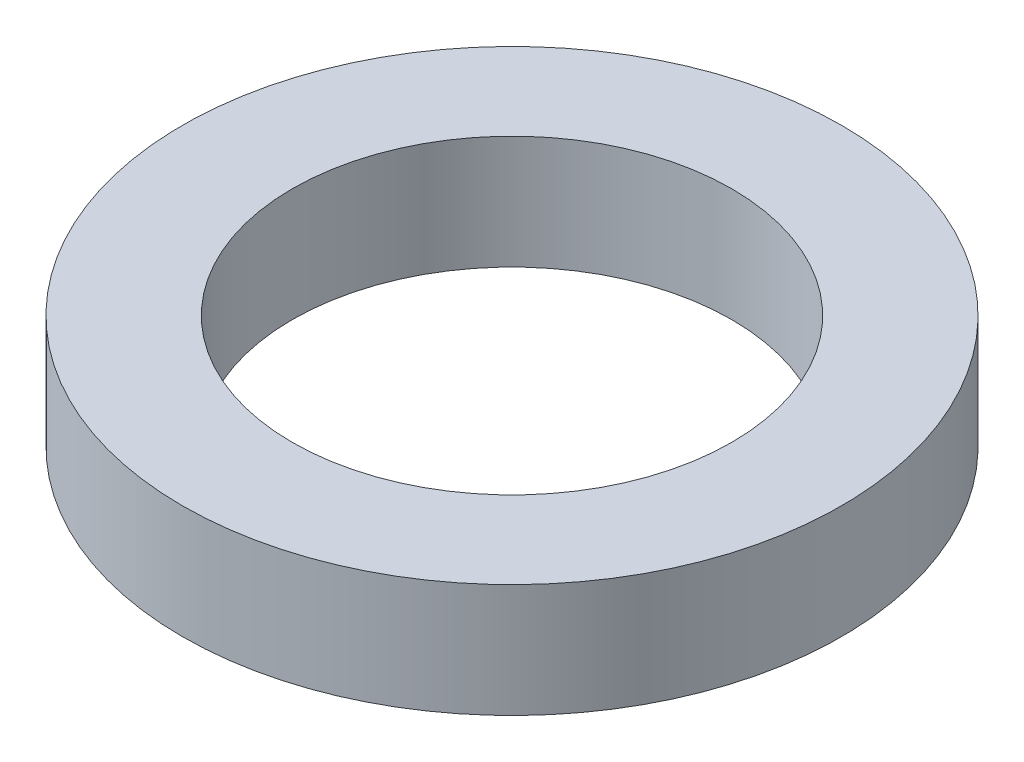
ISO-10303-21;
HEADER;
FILE_DESCRIPTION(('STEP AP214'),'2;1');
FILE_NAME('part.step','',(''),(''),'','','');
FILE_SCHEMA(('AUTOMOTIVE_DESIGN { 1 0 10303 214 1 1 1 1 }'));
ENDSEC;
DATA;
#1=APPLICATION_CONTEXT('core data for automotive mechanical design processes');
#2=APPLICATION_PROTOCOL_DEFINITION('international standard','automotive_design',2000,#1);
#3=PRODUCT_CONTEXT('',#1,'mechanical');
#4=PRODUCT('Part','Part','',(#3));
#5=PRODUCT_RELATED_PRODUCT_CATEGORY('part','',(#4));
#6=PRODUCT_DEFINITION_FORMATION('','',#4);
#7=PRODUCT_DEFINITION_CONTEXT('part definition',#1,'design');
#8=PRODUCT_DEFINITION('design','',#6,#7);
#9=PRODUCT_DEFINITION_SHAPE('','',#8);
#10=(LENGTH_UNIT() NAMED_UNIT(*) SI_UNIT(.MILLI.,.METRE.));
#11=(NAMED_UNIT(*) PLANE_ANGLE_UNIT() SI_UNIT($,.RADIAN.));
#12=(NAMED_UNIT(*) SI_UNIT($,.STERADIAN.) SOLID_ANGLE_UNIT());
#13=UNCERTAINTY_MEASURE_WITH_UNIT(LENGTH_MEASURE(1.E-05),#10,'distance_accuracy_value','');
#14=(GEOMETRIC_REPRESENTATION_CONTEXT(3) GLOBAL_UNCERTAINTY_ASSIGNED_CONTEXT((#13)) GLOBAL_UNIT_ASSIGNED_CONTEXT((#10,
#11,#12)) REPRESENTATION_CONTEXT('',''));
#15=CARTESIAN_POINT('',(0.,0.,0.));
#16=DIRECTION('',(0.,0.,1.));
#17=DIRECTION('',(1.,0.,0.));
#18=AXIS2_PLACEMENT_3D('',#15,#16,#17);
#19=CARTESIAN_POINT('',(0.,1.6383,0.));
#20=DIRECTION('',(0.,1.,0.));
#21=DIRECTION('',(0.,0.,1.));
#22=AXIS2_PLACEMENT_3D('',#19,#20,#21);
#23=PLANE('',#22);
#24=CARTESIAN_POINT('',(0.,1.6383,0.));
#25=DIRECTION('',(0.,1.,0.));
#26=DIRECTION('',(1.,0.,0.));
#27=AXIS2_PLACEMENT_3D('',#24,#25,#26);
#28=CIRCLE('',#27,4.7625);
#29=CARTESIAN_POINT('',(0.,1.6383,-4.7625));
#30=VERTEX_POINT('',#29);
#31=EDGE_CURVE('E11',#30,#30,#28,.T.);
#32=ORIENTED_EDGE('',*,*,#31,.T.);
#33=EDGE_LOOP('',(#32));
#34=FACE_BOUND('',#33,.T.);
#35=CARTESIAN_POINT('',(0.,1.6383,0.));
#36=DIRECTION('',(0.,1.,0.));
#37=DIRECTION('',(0.,0.,1.));
#38=AXIS2_PLACEMENT_3D('',#35,#36,#37);
#39=CIRCLE('',#38,3.175);
#40=CARTESIAN_POINT('',(0.,1.6383,-3.175));
#41=VERTEX_POINT('',#40);
#42=EDGE_CURVE('E56',#41,#41,#39,.T.);
#43=ORIENTED_EDGE('',*,*,#42,.F.);
#44=EDGE_LOOP('',(#43));
#45=FACE_BOUND('',#44,.T.);
#46=ADVANCED_FACE('F43',(#34,#45),#23,.T.);
#47=CARTESIAN_POINT('',(0.,0.,0.));
#48=DIRECTION('',(0.,1.,0.));
#49=DIRECTION('',(0.,0.,1.));
#50=AXIS2_PLACEMENT_3D('',#47,#48,#49);
#51=PLANE('',#50);
#52=CARTESIAN_POINT('',(0.,0.,0.));
#53=DIRECTION('',(0.,1.,0.));
#54=DIRECTION('',(1.,0.,0.));
#55=AXIS2_PLACEMENT_3D('',#52,#53,#54);
#56=CIRCLE('',#55,4.7625);
#57=CARTESIAN_POINT('',(0.,0.,-4.7625));
#58=VERTEX_POINT('',#57);
#59=EDGE_CURVE('E47',#58,#58,#56,.T.);
#60=ORIENTED_EDGE('',*,*,#59,.F.);
#61=EDGE_LOOP('',(#60));
#62=FACE_BOUND('',#61,.T.);
#63=CARTESIAN_POINT('',(0.,0.,0.));
#64=DIRECTION('',(0.,1.,0.));
#65=DIRECTION('',(0.,0.,1.));
#66=AXIS2_PLACEMENT_3D('',#63,#64,#65);
#67=CIRCLE('',#66,3.175);
#68=CARTESIAN_POINT('',(0.,0.,-3.175));
#69=VERTEX_POINT('',#68);
#70=EDGE_CURVE('E58',#69,#69,#67,.T.);
#71=ORIENTED_EDGE('',*,*,#70,.T.);
#72=EDGE_LOOP('',(#71));
#73=FACE_BOUND('',#72,.T.);
#74=ADVANCED_FACE('F70',(#62,#73),#51,.F.);
#75=CARTESIAN_POINT('',(0.,1.6383,0.));
#76=DIRECTION('',(0.,-1.,0.));
#77=DIRECTION('',(0.,0.,-1.));
#78=AXIS2_PLACEMENT_3D('',#75,#76,#77);
#79=CYLINDRICAL_SURFACE('',#78,4.7625);
#80=CARTESIAN_POINT('',(0.,1.6383,-4.7625));
#81=CARTESIAN_POINT('',(0.,1.621234375,-4.7625));
#82=CARTESIAN_POINT('',(0.,1.60416875,-4.7625));
#83=CARTESIAN_POINT('',(0.,1.5700375,-4.7625));
#84=CARTESIAN_POINT('',(0.,1.552971875,-4.7625));
#85=CARTESIAN_POINT('',(0.,1.518840625,-4.7625));
#86=CARTESIAN_POINT('',(0.,1.501775,-4.7625));
#87=CARTESIAN_POINT('',(0.,1.46764375,-4.7625));
#88=CARTESIAN_POINT('',(0.,1.450578125,-4.7625));
#89=CARTESIAN_POINT('',(0.,1.416446875,-4.7625));
#90=CARTESIAN_POINT('',(0.,1.39938125,-4.7625));
#91=CARTESIAN_POINT('',(0.,1.36525,-4.7625));
#92=CARTESIAN_POINT('',(0.,1.348184375,-4.7625));
#93=CARTESIAN_POINT('',(0.,1.314053125,-4.7625));
#94=CARTESIAN_POINT('',(0.,1.2969875,-4.7625));
#95=CARTESIAN_POINT('',(0.,1.26285625,-4.7625));
#96=CARTESIAN_POINT('',(0.,1.245790625,-4.7625));
#97=CARTESIAN_POINT('',(0.,1.211659375,-4.7625));
#98=CARTESIAN_POINT('',(0.,1.19459375,-4.7625));
#99=CARTESIAN_POINT('',(0.,1.1604625,-4.7625));
#100=CARTESIAN_POINT('',(0.,1.143396875,-4.7625));
#101=CARTESIAN_POINT('',(0.,1.109265625,-4.7625));
#102=CARTESIAN_POINT('',(0.,1.0922,-4.7625));
#103=CARTESIAN_POINT('',(0.,1.05806875,-4.7625));
#104=CARTESIAN_POINT('',(0.,1.041003125,-4.7625));
#105=CARTESIAN_POINT('',(0.,1.006871875,-4.7625));
#106=CARTESIAN_POINT('',(0.,0.98980625,-4.7625));
#107=CARTESIAN_POINT('',(0.,0.955675,-4.7625));
#108=CARTESIAN_POINT('',(0.,0.938609375,-4.7625));
#109=CARTESIAN_POINT('',(0.,0.904478125,-4.7625));
#110=CARTESIAN_POINT('',(0.,0.8874125,-4.7625));
#111=CARTESIAN_POINT('',(0.,0.85328125,-4.7625));
#112=CARTESIAN_POINT('',(0.,0.836215625,-4.7625));
#113=CARTESIAN_POINT('',(0.,0.802084375,-4.7625));
#114=CARTESIAN_POINT('',(0.,0.78501875,-4.7625));
#115=CARTESIAN_POINT('',(0.,0.7508875,-4.7625));
#116=CARTESIAN_POINT('',(0.,0.733821875,-4.7625));
#117=CARTESIAN_POINT('',(0.,0.699690625,-4.7625));
#118=CARTESIAN_POINT('',(0.,0.682625,-4.7625));
#119=CARTESIAN_POINT('',(0.,0.64849375,-4.7625));
#120=CARTESIAN_POINT('',(0.,0.631428125,-4.7625));
#121=CARTESIAN_POINT('',(0.,0.597296875,-4.7625));
#122=CARTESIAN_POINT('',(0.,0.58023125,-4.7625));
#123=CARTESIAN_POINT('',(0.,0.5461,-4.7625));
#124=CARTESIAN_POINT('',(0.,0.529034375,-4.7625));
#125=CARTESIAN_POINT('',(0.,0.494903125,-4.7625));
#126=CARTESIAN_POINT('',(0.,0.4778375,-4.7625));
#127=CARTESIAN_POINT('',(0.,0.44370625,-4.7625));
#128=CARTESIAN_POINT('',(0.,0.426640625,-4.7625));
#129=CARTESIAN_POINT('',(0.,0.392509375,-4.7625));
#130=CARTESIAN_POINT('',(0.,0.37544375,-4.7625));
#131=CARTESIAN_POINT('',(0.,0.3413125,-4.7625));
#132=CARTESIAN_POINT('',(0.,0.324246875,-4.7625));
#133=CARTESIAN_POINT('',(0.,0.290115625,-4.7625));
#134=CARTESIAN_POINT('',(0.,0.27305,-4.7625));
#135=CARTESIAN_POINT('',(0.,0.23891875,-4.7625));
#136=CARTESIAN_POINT('',(0.,0.221853125,-4.7625));
#137=CARTESIAN_POINT('',(0.,0.187721875,-4.7625));
#138=CARTESIAN_POINT('',(0.,0.17065625,-4.7625));
#139=CARTESIAN_POINT('',(0.,0.136525,-4.7625));
#140=CARTESIAN_POINT('',(0.,0.119459375,-4.7625));
#141=CARTESIAN_POINT('',(0.,0.0853281249999999,-4.7625));
#142=CARTESIAN_POINT('',(0.,0.0682624999999999,-4.7625));
#143=CARTESIAN_POINT('',(0.,0.0341312499999998,-4.7625));
#144=CARTESIAN_POINT('',(0.,0.0170656249999998,-4.7625));
#145=CARTESIAN_POINT('',(0.,0.,-4.7625));
#146=B_SPLINE_CURVE_WITH_KNOTS('',3,(#80,#81,#82,#83,#84,#85,#86,#87,#88,#89,#90,#91,#92,#93,
#94,#95,#96,#97,#98,#99,#100,#101,#102,#103,#104,#105,#106,#107,#108,#109,#110,#111,#112,#113,
#114,#115,#116,#117,#118,#119,#120,#121,#122,#123,#124,#125,#126,#127,#128,#129,#130,#131,#132,
#133,#134,#135,#136,#137,#138,#139,#140,#141,#142,#143,#144,#145),.UNSPECIFIED.,.F.,.F.,(4,2,2,
2,2,2,2,2,2,2,2,2,2,2,2,2,2,2,2,2,2,2,2,2,2,2,2,2,2,2,2,2,4),(0.,0.0511968750000001,0.10239375,
0.153590625,0.2047875,0.255984375,0.30718125,0.358378125,0.409575,0.460771875,0.51196875,
0.563165625,0.6143625,0.665559375,0.71675625,0.767953125,0.81915,0.870346875,0.92154375,
0.972740625,1.0239375,1.075134375,1.12633125,1.177528125,1.228725,1.279921875,1.33111875,
1.382315625,1.4335125,1.484709375,1.53590625,1.587103125,1.6383),.UNSPECIFIED.);
#147=EDGE_CURVE('BSEAM45',#30,#58,#146,.T.);
#148=ORIENTED_EDGE('',*,*,#31,.F.);
#149=ORIENTED_EDGE('',*,*,#59,.T.);
#150=ORIENTED_EDGE('',*,*,#147,.T.);
#151=ORIENTED_EDGE('',*,*,#147,.F.);
#152=EDGE_LOOP('',(#148,#150,#149,#151));
#153=FACE_BOUND('',#152,.T.);
#154=ADVANCED_FACE('F45',(#153),#79,.T.);
#155=CARTESIAN_POINT('',(0.,1.6383,0.));
#156=DIRECTION('',(0.,-1.,0.));
#157=DIRECTION('',(0.,0.,-1.));
#158=AXIS2_PLACEMENT_3D('',#155,#156,#157);
#159=CYLINDRICAL_SURFACE('',#158,3.175);
#160=CARTESIAN_POINT('',(0.,1.6383,-3.175));
#161=CARTESIAN_POINT('',(0.,1.621234375,-3.175));
#162=CARTESIAN_POINT('',(0.,1.60416875,-3.175));
#163=CARTESIAN_POINT('',(0.,1.5700375,-3.175));
#164=CARTESIAN_POINT('',(0.,1.552971875,-3.175));
#165=CARTESIAN_POINT('',(0.,1.518840625,-3.175));
#166=CARTESIAN_POINT('',(0.,1.501775,-3.175));
#167=CARTESIAN_POINT('',(0.,1.46764375,-3.175));
#168=CARTESIAN_POINT('',(0.,1.450578125,-3.175));
#169=CARTESIAN_POINT('',(0.,1.416446875,-3.175));
#170=CARTESIAN_POINT('',(0.,1.39938125,-3.175));
#171=CARTESIAN_POINT('',(0.,1.36525,-3.175));
#172=CARTESIAN_POINT('',(0.,1.348184375,-3.175));
#173=CARTESIAN_POINT('',(0.,1.314053125,-3.175));
#174=CARTESIAN_POINT('',(0.,1.2969875,-3.175));
#175=CARTESIAN_POINT('',(0.,1.26285625,-3.175));
#176=CARTESIAN_POINT('',(0.,1.245790625,-3.175));
#177=CARTESIAN_POINT('',(0.,1.211659375,-3.175));
#178=CARTESIAN_POINT('',(0.,1.19459375,-3.175));
#179=CARTESIAN_POINT('',(0.,1.1604625,-3.175));
#180=CARTESIAN_POINT('',(0.,1.143396875,-3.175));
#181=CARTESIAN_POINT('',(0.,1.109265625,-3.175));
#182=CARTESIAN_POINT('',(0.,1.0922,-3.175));
#183=CARTESIAN_POINT('',(0.,1.05806875,-3.175));
#184=CARTESIAN_POINT('',(0.,1.041003125,-3.175));
#185=CARTESIAN_POINT('',(0.,1.006871875,-3.175));
#186=CARTESIAN_POINT('',(0.,0.98980625,-3.175));
#187=CARTESIAN_POINT('',(0.,0.955675,-3.175));
#188=CARTESIAN_POINT('',(0.,0.938609375,-3.175));
#189=CARTESIAN_POINT('',(0.,0.904478125,-3.175));
#190=CARTESIAN_POINT('',(0.,0.8874125,-3.175));
#191=CARTESIAN_POINT('',(0.,0.85328125,-3.175));
#192=CARTESIAN_POINT('',(0.,0.836215625,-3.175));
#193=CARTESIAN_POINT('',(0.,0.802084375,-3.175));
#194=CARTESIAN_POINT('',(0.,0.78501875,-3.175));
#195=CARTESIAN_POINT('',(0.,0.7508875,-3.175));
#196=CARTESIAN_POINT('',(0.,0.733821875,-3.175));
#197=CARTESIAN_POINT('',(0.,0.699690625,-3.175));
#198=CARTESIAN_POINT('',(0.,0.682625,-3.175));
#199=CARTESIAN_POINT('',(0.,0.64849375,-3.175));
#200=CARTESIAN_POINT('',(0.,0.631428125,-3.175));
#201=CARTESIAN_POINT('',(0.,0.597296875,-3.175));
#202=CARTESIAN_POINT('',(0.,0.58023125,-3.175));
#203=CARTESIAN_POINT('',(0.,0.5461,-3.175));
#204=CARTESIAN_POINT('',(0.,0.529034375,-3.175));
#205=CARTESIAN_POINT('',(0.,0.494903125,-3.175));
#206=CARTESIAN_POINT('',(0.,0.4778375,-3.175));
#207=CARTESIAN_POINT('',(0.,0.44370625,-3.175));
#208=CARTESIAN_POINT('',(0.,0.426640625,-3.175));
#209=CARTESIAN_POINT('',(0.,0.392509375,-3.175));
#210=CARTESIAN_POINT('',(0.,0.37544375,-3.175));
#211=CARTESIAN_POINT('',(0.,0.3413125,-3.175));
#212=CARTESIAN_POINT('',(0.,0.324246875,-3.175));
#213=CARTESIAN_POINT('',(0.,0.290115625,-3.175));
#214=CARTESIAN_POINT('',(0.,0.27305,-3.175));
#215=CARTESIAN_POINT('',(0.,0.23891875,-3.175));
#216=CARTESIAN_POINT('',(0.,0.221853125,-3.175));
#217=CARTESIAN_POINT('',(0.,0.187721875,-3.175));
#218=CARTESIAN_POINT('',(0.,0.17065625,-3.175));
#219=CARTESIAN_POINT('',(0.,0.136525,-3.175));
#220=CARTESIAN_POINT('',(0.,0.119459375,-3.175));
#221=CARTESIAN_POINT('',(0.,0.0853281249999998,-3.175));
#222=CARTESIAN_POINT('',(0.,0.0682624999999998,-3.175));
#223=CARTESIAN_POINT('',(0.,0.0341312499999998,-3.175));
#224=CARTESIAN_POINT('',(0.,0.0170656249999998,-3.175));
#225=CARTESIAN_POINT('',(0.,0.,-3.175));
#226=B_SPLINE_CURVE_WITH_KNOTS('',3,(#160,#161,#162,#163,#164,#165,#166,#167,#168,#169,#170,
#171,#172,#173,#174,#175,#176,#177,#178,#179,#180,#181,#182,#183,#184,#185,#186,#187,#188,#189,
#190,#191,#192,#193,#194,#195,#196,#197,#198,#199,#200,#201,#202,#203,#204,#205,#206,#207,#208,
#209,#210,#211,#212,#213,#214,#215,#216,#217,#218,#219,#220,#221,#222,#223,#224,#225),
.UNSPECIFIED.,.F.,.F.,(4,2,2,2,2,2,2,2,2,2,2,2,2,2,2,2,2,2,2,2,2,2,2,2,2,2,2,2,2,2,2,2,4),(0.,
0.0511968749999999,0.10239375,0.153590625,0.2047875,0.255984375,0.30718125,0.358378125,0.409575,
0.460771875,0.51196875,0.563165625,0.6143625,0.665559375,0.71675625,0.767953125,0.81915,
0.870346875,0.92154375,0.972740625,1.0239375,1.075134375,1.12633125,1.177528125,1.228725,
1.279921875,1.33111875,1.382315625,1.4335125,1.484709375,1.53590625,1.587103125,1.6383),.UNSPECIFIED.);
#227=EDGE_CURVE('BSEAM66',#41,#69,#226,.T.);
#228=ORIENTED_EDGE('',*,*,#42,.T.);
#229=ORIENTED_EDGE('',*,*,#70,.F.);
#230=ORIENTED_EDGE('',*,*,#227,.T.);
#231=ORIENTED_EDGE('',*,*,#227,.F.);
#232=EDGE_LOOP('',(#228,#230,#229,#231));
#233=FACE_BOUND('',#232,.T.);
#234=ADVANCED_FACE('F66',(#233),#159,.F.);
#235=CLOSED_SHELL('',(#46,#74,#154,#234));
#236=MANIFOLD_SOLID_BREP('B2',#235);
#237=ADVANCED_BREP_SHAPE_REPRESENTATION('',(#18,#236),#14);
#238=SHAPE_DEFINITION_REPRESENTATION(#9,#237);
ENDSEC;
END-ISO-10303-21;
